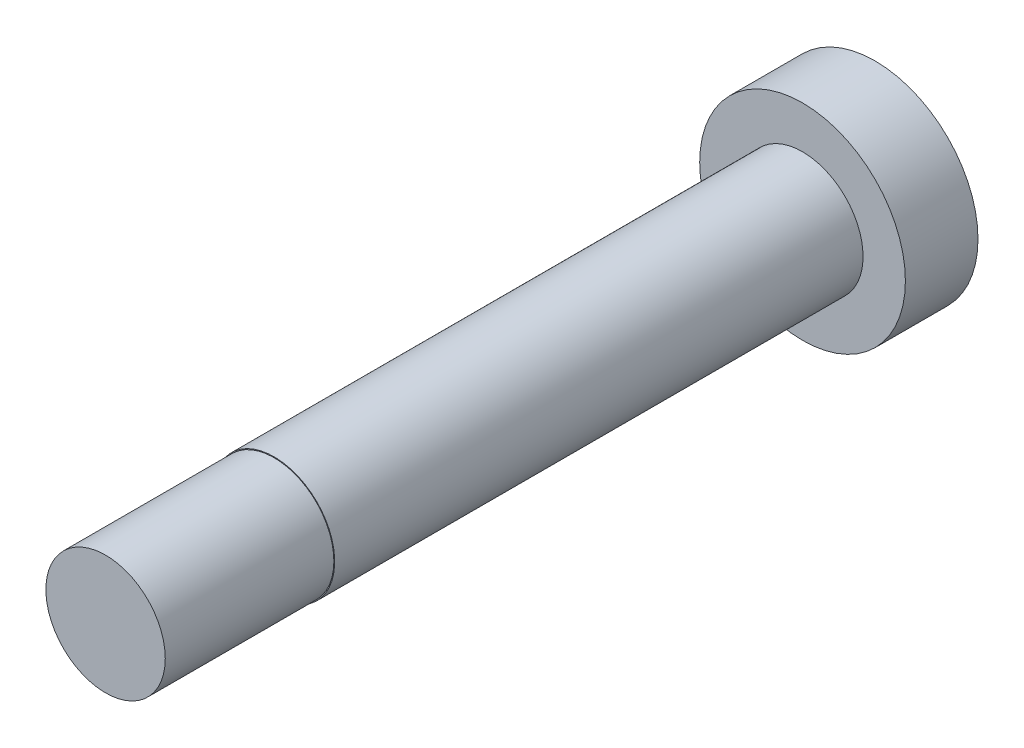
ISO-10303-21;
HEADER;
FILE_DESCRIPTION(('STEP AP214'),'2;1');
FILE_NAME('part.step','',(''),(''),'','','');
FILE_SCHEMA(('AUTOMOTIVE_DESIGN { 1 0 10303 214 1 1 1 1 }'));
ENDSEC;
DATA;
#1=APPLICATION_CONTEXT('core data for automotive mechanical design processes');
#2=APPLICATION_PROTOCOL_DEFINITION('international standard','automotive_design',2000,#1);
#3=PRODUCT_CONTEXT('',#1,'mechanical');
#4=PRODUCT('Part','Part','',(#3));
#5=PRODUCT_RELATED_PRODUCT_CATEGORY('part','',(#4));
#6=PRODUCT_DEFINITION_FORMATION('','',#4);
#7=PRODUCT_DEFINITION_CONTEXT('part definition',#1,'design');
#8=PRODUCT_DEFINITION('design','',#6,#7);
#9=PRODUCT_DEFINITION_SHAPE('','',#8);
#10=(LENGTH_UNIT() NAMED_UNIT(*) SI_UNIT(.MILLI.,.METRE.));
#11=(NAMED_UNIT(*) PLANE_ANGLE_UNIT() SI_UNIT($,.RADIAN.));
#12=(NAMED_UNIT(*) SI_UNIT($,.STERADIAN.) SOLID_ANGLE_UNIT());
#13=UNCERTAINTY_MEASURE_WITH_UNIT(LENGTH_MEASURE(1.E-05),#10,'distance_accuracy_value','');
#14=(GEOMETRIC_REPRESENTATION_CONTEXT(3) GLOBAL_UNCERTAINTY_ASSIGNED_CONTEXT((#13)) GLOBAL_UNIT_ASSIGNED_CONTEXT((#10,
#11,#12)) REPRESENTATION_CONTEXT('',''));
#15=CARTESIAN_POINT('',(0.,0.,0.));
#16=DIRECTION('',(0.,0.,1.));
#17=DIRECTION('',(1.,0.,0.));
#18=AXIS2_PLACEMENT_3D('',#15,#16,#17);
#19=CARTESIAN_POINT('',(0.,0.,-1.8));
#20=DIRECTION('',(0.,0.,1.));
#21=DIRECTION('',(1.,0.,0.));
#22=AXIS2_PLACEMENT_3D('',#19,#20,#21);
#23=PLANE('',#22);
#24=CARTESIAN_POINT('',(0.,0.,-1.8));
#25=DIRECTION('',(0.,0.,1.));
#26=DIRECTION('',(1.,0.,0.));
#27=AXIS2_PLACEMENT_3D('',#24,#25,#26);
#28=CIRCLE('',#27,2.55);
#29=CARTESIAN_POINT('',(2.55,0.,-1.8));
#30=VERTEX_POINT('',#29);
#31=EDGE_CURVE('E122',#30,#30,#28,.T.);
#32=ORIENTED_EDGE('',*,*,#31,.F.);
#33=EDGE_LOOP('',(#32));
#34=FACE_BOUND('',#33,.T.);
#35=DIRECTION('',(0.,-1.,0.));
#36=VECTOR('',#35,1.);
#37=CARTESIAN_POINT('',(0.995929214352104,0.,-1.8));
#38=LINE('',#37,#36);
#39=CARTESIAN_POINT('',(0.995929214352104,0.575,-1.8));
#40=VERTEX_POINT('',#39);
#41=CARTESIAN_POINT('',(0.995929214352104,-0.575000000000001,-1.8));
#42=VERTEX_POINT('',#41);
#43=EDGE_CURVE('E11',#40,#42,#38,.T.);
#44=ORIENTED_EDGE('',*,*,#43,.F.);
#45=DIRECTION('',(0.866025403784439,-0.5,0.));
#46=VECTOR('',#45,1.);
#47=CARTESIAN_POINT('',(0.497964607176052,0.8625,-1.8));
#48=LINE('',#47,#46);
#49=CARTESIAN_POINT('',(0.,1.15,-1.8));
#50=VERTEX_POINT('',#49);
#51=EDGE_CURVE('E50',#50,#40,#48,.T.);
#52=ORIENTED_EDGE('',*,*,#51,.F.);
#53=DIRECTION('',(0.866025403784439,0.5,0.));
#54=VECTOR('',#53,1.);
#55=CARTESIAN_POINT('',(-0.497964607176052,0.8625,-1.8));
#56=LINE('',#55,#54);
#57=CARTESIAN_POINT('',(-0.995929214352104,0.575,-1.8));
#58=VERTEX_POINT('',#57);
#59=EDGE_CURVE('E140',#58,#50,#56,.T.);
#60=ORIENTED_EDGE('',*,*,#59,.F.);
#61=DIRECTION('',(0.,1.,0.));
#62=VECTOR('',#61,1.);
#63=CARTESIAN_POINT('',(-0.995929214352104,0.,-1.8));
#64=LINE('',#63,#62);
#65=CARTESIAN_POINT('',(-0.995929214352104,-0.575,-1.8));
#66=VERTEX_POINT('',#65);
#67=EDGE_CURVE('E135',#66,#58,#64,.T.);
#68=ORIENTED_EDGE('',*,*,#67,.F.);
#69=DIRECTION('',(-0.866025403784439,0.5,0.));
#70=VECTOR('',#69,1.);
#71=CARTESIAN_POINT('',(-0.497964607176052,-0.8625,-1.8));
#72=LINE('',#71,#70);
#73=CARTESIAN_POINT('',(0.,-1.15,-1.8));
#74=VERTEX_POINT('',#73);
#75=EDGE_CURVE('E134',#74,#66,#72,.T.);
#76=ORIENTED_EDGE('',*,*,#75,.F.);
#77=DIRECTION('',(-0.866025403784439,-0.5,0.));
#78=VECTOR('',#77,1.);
#79=CARTESIAN_POINT('',(0.497964607176052,-0.8625,-1.8));
#80=LINE('',#79,#78);
#81=EDGE_CURVE('E120',#42,#74,#80,.T.);
#82=ORIENTED_EDGE('',*,*,#81,.F.);
#83=EDGE_LOOP('',(#44,#52,#60,#68,#76,#82));
#84=FACE_BOUND('',#83,.T.);
#85=ADVANCED_FACE('F39',(#34,#84),#23,.F.);
#86=CARTESIAN_POINT('',(0.,0.,0.));
#87=DIRECTION('',(0.,0.,-1.));
#88=DIRECTION('',(-1.,0.,0.));
#89=AXIS2_PLACEMENT_3D('',#86,#87,#88);
#90=CYLINDRICAL_SURFACE('',#89,2.55);
#91=CARTESIAN_POINT('',(0.,0.,0.));
#92=DIRECTION('',(0.,0.,1.));
#93=DIRECTION('',(1.,0.,0.));
#94=AXIS2_PLACEMENT_3D('',#91,#92,#93);
#95=CIRCLE('',#94,2.55);
#96=CARTESIAN_POINT('',(2.55,0.,0.));
#97=VERTEX_POINT('',#96);
#98=EDGE_CURVE('E130',#97,#97,#95,.T.);
#99=ORIENTED_EDGE('',*,*,#98,.F.);
#100=EDGE_LOOP('',(#99));
#101=FACE_BOUND('',#100,.T.);
#102=ORIENTED_EDGE('',*,*,#31,.T.);
#103=EDGE_LOOP('',(#102));
#104=FACE_BOUND('',#103,.T.);
#105=ADVANCED_FACE('F41',(#101,#104),#90,.T.);
#106=CARTESIAN_POINT('',(0.,0.,0.));
#107=DIRECTION('',(0.,0.,1.));
#108=DIRECTION('',(1.,0.,0.));
#109=AXIS2_PLACEMENT_3D('',#106,#107,#108);
#110=PLANE('',#109);
#111=CARTESIAN_POINT('',(0.,0.,0.));
#112=DIRECTION('',(0.,0.,1.));
#113=DIRECTION('',(1.,0.,0.));
#114=AXIS2_PLACEMENT_3D('',#111,#112,#113);
#115=CIRCLE('',#114,1.5);
#116=CARTESIAN_POINT('',(-1.5,0.,0.));
#117=VERTEX_POINT('',#116);
#118=EDGE_CURVE('E123',#117,#117,#115,.T.);
#119=ORIENTED_EDGE('',*,*,#118,.F.);
#120=EDGE_LOOP('',(#119));
#121=FACE_BOUND('',#120,.T.);
#122=ORIENTED_EDGE('',*,*,#98,.T.);
#123=EDGE_LOOP('',(#122));
#124=FACE_BOUND('',#123,.T.);
#125=ADVANCED_FACE('F184',(#121,#124),#110,.T.);
#126=CARTESIAN_POINT('',(0.,0.,13.1));
#127=DIRECTION('',(0.,0.,-1.));
#128=DIRECTION('',(-1.,0.,0.));
#129=AXIS2_PLACEMENT_3D('',#126,#127,#128);
#130=CYLINDRICAL_SURFACE('',#129,1.5);
#131=CARTESIAN_POINT('',(0.,0.,13.1));
#132=DIRECTION('',(0.,0.,1.));
#133=DIRECTION('',(1.,0.,0.));
#134=AXIS2_PLACEMENT_3D('',#131,#132,#133);
#135=CIRCLE('',#134,1.5);
#136=CARTESIAN_POINT('',(-1.5,0.,13.1));
#137=VERTEX_POINT('',#136);
#138=EDGE_CURVE('E112',#137,#137,#135,.T.);
#139=CARTESIAN_POINT('',(-1.5,0.,13.1));
#140=CARTESIAN_POINT('',(-1.5,0.,12.9635416666667));
#141=CARTESIAN_POINT('',(-1.5,0.,12.8270833333333));
#142=CARTESIAN_POINT('',(-1.5,0.,12.5541666666667));
#143=CARTESIAN_POINT('',(-1.5,0.,12.4177083333333));
#144=CARTESIAN_POINT('',(-1.5,0.,12.1447916666667));
#145=CARTESIAN_POINT('',(-1.5,0.,12.0083333333333));
#146=CARTESIAN_POINT('',(-1.5,0.,11.7354166666667));
#147=CARTESIAN_POINT('',(-1.5,0.,11.5989583333333));
#148=CARTESIAN_POINT('',(-1.5,0.,11.3260416666667));
#149=CARTESIAN_POINT('',(-1.5,0.,11.1895833333333));
#150=CARTESIAN_POINT('',(-1.5,0.,10.9166666666667));
#151=CARTESIAN_POINT('',(-1.5,0.,10.7802083333333));
#152=CARTESIAN_POINT('',(-1.5,0.,10.5072916666667));
#153=CARTESIAN_POINT('',(-1.5,0.,10.3708333333333));
#154=CARTESIAN_POINT('',(-1.5,0.,10.0979166666667));
#155=CARTESIAN_POINT('',(-1.5,0.,9.96145833333333));
#156=CARTESIAN_POINT('',(-1.5,0.,9.68854166666667));
#157=CARTESIAN_POINT('',(-1.5,0.,9.55208333333333));
#158=CARTESIAN_POINT('',(-1.5,0.,9.27916666666667));
#159=CARTESIAN_POINT('',(-1.5,0.,9.14270833333333));
#160=CARTESIAN_POINT('',(-1.5,0.,8.86979166666667));
#161=CARTESIAN_POINT('',(-1.5,0.,8.73333333333333));
#162=CARTESIAN_POINT('',(-1.5,0.,8.46041666666667));
#163=CARTESIAN_POINT('',(-1.5,0.,8.32395833333333));
#164=CARTESIAN_POINT('',(-1.5,0.,8.05104166666667));
#165=CARTESIAN_POINT('',(-1.5,0.,7.91458333333333));
#166=CARTESIAN_POINT('',(-1.5,0.,7.64166666666667));
#167=CARTESIAN_POINT('',(-1.5,0.,7.50520833333333));
#168=CARTESIAN_POINT('',(-1.5,0.,7.23229166666667));
#169=CARTESIAN_POINT('',(-1.5,0.,7.09583333333333));
#170=CARTESIAN_POINT('',(-1.5,0.,6.82291666666667));
#171=CARTESIAN_POINT('',(-1.5,0.,6.68645833333333));
#172=CARTESIAN_POINT('',(-1.5,0.,6.41354166666667));
#173=CARTESIAN_POINT('',(-1.5,0.,6.27708333333333));
#174=CARTESIAN_POINT('',(-1.5,0.,6.00416666666667));
#175=CARTESIAN_POINT('',(-1.5,0.,5.86770833333333));
#176=CARTESIAN_POINT('',(-1.5,0.,5.59479166666667));
#177=CARTESIAN_POINT('',(-1.5,0.,5.45833333333333));
#178=CARTESIAN_POINT('',(-1.5,0.,5.18541666666667));
#179=CARTESIAN_POINT('',(-1.5,0.,5.04895833333333));
#180=CARTESIAN_POINT('',(-1.5,0.,4.77604166666667));
#181=CARTESIAN_POINT('',(-1.5,0.,4.63958333333333));
#182=CARTESIAN_POINT('',(-1.5,0.,4.36666666666667));
#183=CARTESIAN_POINT('',(-1.5,0.,4.23020833333333));
#184=CARTESIAN_POINT('',(-1.5,0.,3.95729166666667));
#185=CARTESIAN_POINT('',(-1.5,0.,3.82083333333333));
#186=CARTESIAN_POINT('',(-1.5,0.,3.54791666666666));
#187=CARTESIAN_POINT('',(-1.5,0.,3.41145833333333));
#188=CARTESIAN_POINT('',(-1.5,0.,3.13854166666667));
#189=CARTESIAN_POINT('',(-1.5,0.,3.00208333333333));
#190=CARTESIAN_POINT('',(-1.5,0.,2.72916666666666));
#191=CARTESIAN_POINT('',(-1.5,0.,2.59270833333333));
#192=CARTESIAN_POINT('',(-1.5,0.,2.31979166666666));
#193=CARTESIAN_POINT('',(-1.5,0.,2.18333333333333));
#194=CARTESIAN_POINT('',(-1.5,0.,1.91041666666667));
#195=CARTESIAN_POINT('',(-1.5,0.,1.77395833333333));
#196=CARTESIAN_POINT('',(-1.5,0.,1.50104166666667));
#197=CARTESIAN_POINT('',(-1.5,0.,1.36458333333333));
#198=CARTESIAN_POINT('',(-1.5,0.,1.09166666666667));
#199=CARTESIAN_POINT('',(-1.5,0.,0.955208333333332));
#200=CARTESIAN_POINT('',(-1.5,0.,0.682291666666665));
#201=CARTESIAN_POINT('',(-1.5,0.,0.545833333333332));
#202=CARTESIAN_POINT('',(-1.5,0.,0.272916666666665));
#203=CARTESIAN_POINT('',(-1.5,0.,0.136458333333332));
#204=CARTESIAN_POINT('',(-1.5,0.,0.));
#205=B_SPLINE_CURVE_WITH_KNOTS('',3,(#139,#140,#141,#142,#143,#144,#145,#146,#147,#148,#149,
#150,#151,#152,#153,#154,#155,#156,#157,#158,#159,#160,#161,#162,#163,#164,#165,#166,#167,#168,
#169,#170,#171,#172,#173,#174,#175,#176,#177,#178,#179,#180,#181,#182,#183,#184,#185,#186,#187,
#188,#189,#190,#191,#192,#193,#194,#195,#196,#197,#198,#199,#200,#201,#202,#203,#204),
.UNSPECIFIED.,.F.,.F.,(4,2,2,2,2,2,2,2,2,2,2,2,2,2,2,2,2,2,2,2,2,2,2,2,2,2,2,2,2,2,2,2,4),(0.,
0.409374999999998,0.818749999999998,1.228125,1.6375,2.046875,2.45625,2.865625,3.275,3.684375,
4.09375,4.503125,4.9125,5.321875,5.73125,6.140625,6.55,6.959375,7.36875,7.778125,8.1875,
8.596875,9.00625,9.415625,9.825,10.234375,10.64375,11.053125,11.4625,11.871875,12.28125,
12.690625,13.1),.UNSPECIFIED.);
#206=EDGE_CURVE('BSEAM190',#137,#117,#205,.T.);
#207=ORIENTED_EDGE('',*,*,#138,.F.);
#208=ORIENTED_EDGE('',*,*,#118,.T.);
#209=ORIENTED_EDGE('',*,*,#206,.T.);
#210=ORIENTED_EDGE('',*,*,#206,.F.);
#211=EDGE_LOOP('',(#207,#209,#208,#210));
#212=FACE_BOUND('',#211,.T.);
#213=ADVANCED_FACE('F190',(#212),#130,.T.);
#214=CARTESIAN_POINT('',(0.,0.,13.1));
#215=DIRECTION('',(0.,0.,1.));
#216=DIRECTION('',(1.,0.,0.));
#217=AXIS2_PLACEMENT_3D('',#214,#215,#216);
#218=PLANE('',#217);
#219=CARTESIAN_POINT('',(0.,0.,13.1));
#220=DIRECTION('',(0.,0.,1.));
#221=DIRECTION('',(1.,0.,0.));
#222=AXIS2_PLACEMENT_3D('',#219,#220,#221);
#223=CIRCLE('',#222,1.48);
#224=CARTESIAN_POINT('',(1.48,0.,13.1));
#225=VERTEX_POINT('',#224);
#226=EDGE_CURVE('E117',#225,#225,#223,.T.);
#227=ORIENTED_EDGE('',*,*,#226,.F.);
#228=EDGE_LOOP('',(#227));
#229=FACE_BOUND('',#228,.T.);
#230=ORIENTED_EDGE('',*,*,#138,.T.);
#231=EDGE_LOOP('',(#230));
#232=FACE_BOUND('',#231,.T.);
#233=ADVANCED_FACE('F192',(#229,#232),#218,.T.);
#234=CARTESIAN_POINT('',(0.,0.,17.28));
#235=DIRECTION('',(0.,0.,-1.));
#236=DIRECTION('',(-1.,0.,0.));
#237=AXIS2_PLACEMENT_3D('',#234,#235,#236);
#238=CYLINDRICAL_SURFACE('',#237,1.48);
#239=CARTESIAN_POINT('',(0.,0.,17.28));
#240=DIRECTION('',(0.,0.,1.));
#241=DIRECTION('',(1.,0.,0.));
#242=AXIS2_PLACEMENT_3D('',#239,#240,#241);
#243=CIRCLE('',#242,1.48);
#244=CARTESIAN_POINT('',(1.48,0.,17.28));
#245=VERTEX_POINT('',#244);
#246=EDGE_CURVE('E110',#245,#245,#243,.T.);
#247=ORIENTED_EDGE('',*,*,#246,.F.);
#248=EDGE_LOOP('',(#247));
#249=FACE_BOUND('',#248,.T.);
#250=ORIENTED_EDGE('',*,*,#226,.T.);
#251=EDGE_LOOP('',(#250));
#252=FACE_BOUND('',#251,.T.);
#253=ADVANCED_FACE('F196',(#249,#252),#238,.T.);
#254=CARTESIAN_POINT('',(0.,0.,17.28));
#255=DIRECTION('',(0.,0.,1.));
#256=DIRECTION('',(1.,0.,0.));
#257=AXIS2_PLACEMENT_3D('',#254,#255,#256);
#258=PLANE('',#257);
#259=ORIENTED_EDGE('',*,*,#246,.T.);
#260=EDGE_LOOP('',(#259));
#261=FACE_BOUND('',#260,.T.);
#262=ADVANCED_FACE('F205',(#261),#258,.T.);
#263=CARTESIAN_POINT('',(0.995929214352104,-0.575000000000001,-0.85));
#264=DIRECTION('',(-1.,0.,0.));
#265=DIRECTION('',(0.,-1.,0.));
#266=AXIS2_PLACEMENT_3D('',#263,#264,#265);
#267=PLANE('',#266);
#268=ORIENTED_EDGE('',*,*,#43,.T.);
#269=DIRECTION('',(0.,0.,-1.));
#270=VECTOR('',#269,1.);
#271=CARTESIAN_POINT('',(0.995929214352104,-0.575000000000001,-0.85));
#272=LINE('',#271,#270);
#273=CARTESIAN_POINT('',(0.995929214352104,-0.575000000000001,-0.85));
#274=VERTEX_POINT('',#273);
#275=EDGE_CURVE('E53',#274,#42,#272,.T.);
#276=ORIENTED_EDGE('',*,*,#275,.F.);
#277=DIRECTION('',(0.,1.,0.));
#278=VECTOR('',#277,1.);
#279=CARTESIAN_POINT('',(0.995929214352104,-0.575000000000001,-0.85));
#280=LINE('',#279,#278);
#281=CARTESIAN_POINT('',(0.995929214352104,0.575,-0.85));
#282=VERTEX_POINT('',#281);
#283=EDGE_CURVE('E96',#274,#282,#280,.T.);
#284=ORIENTED_EDGE('',*,*,#283,.T.);
#285=DIRECTION('',(0.,0.,-1.));
#286=VECTOR('',#285,1.);
#287=CARTESIAN_POINT('',(0.995929214352104,0.575,-0.85));
#288=LINE('',#287,#286);
#289=EDGE_CURVE('E103',#282,#40,#288,.T.);
#290=ORIENTED_EDGE('',*,*,#289,.T.);
#291=EDGE_LOOP('',(#268,#276,#284,#290));
#292=FACE_BOUND('',#291,.T.);
#293=ADVANCED_FACE('F105',(#292),#267,.T.);
#294=CARTESIAN_POINT('',(0.995929214352104,0.575,-0.85));
#295=DIRECTION('',(-0.5,-0.866025403784439,0.));
#296=DIRECTION('',(0.866025403784439,-0.5,0.));
#297=AXIS2_PLACEMENT_3D('',#294,#295,#296);
#298=PLANE('',#297);
#299=ORIENTED_EDGE('',*,*,#51,.T.);
#300=ORIENTED_EDGE('',*,*,#289,.F.);
#301=DIRECTION('',(-0.866025403784439,0.5,0.));
#302=VECTOR('',#301,1.);
#303=CARTESIAN_POINT('',(0.995929214352104,0.575,-0.85));
#304=LINE('',#303,#302);
#305=CARTESIAN_POINT('',(0.,1.15,-0.85));
#306=VERTEX_POINT('',#305);
#307=EDGE_CURVE('E95',#282,#306,#304,.T.);
#308=ORIENTED_EDGE('',*,*,#307,.T.);
#309=DIRECTION('',(0.,0.,-1.));
#310=VECTOR('',#309,1.);
#311=CARTESIAN_POINT('',(0.,1.15,-0.85));
#312=LINE('',#311,#310);
#313=EDGE_CURVE('E107',#306,#50,#312,.T.);
#314=ORIENTED_EDGE('',*,*,#313,.T.);
#315=EDGE_LOOP('',(#299,#300,#308,#314));
#316=FACE_BOUND('',#315,.T.);
#317=ADVANCED_FACE('F106',(#316),#298,.T.);
#318=CARTESIAN_POINT('',(0.,1.15,-0.85));
#319=DIRECTION('',(0.5,-0.866025403784439,0.));
#320=DIRECTION('',(0.866025403784439,0.5,0.));
#321=AXIS2_PLACEMENT_3D('',#318,#319,#320);
#322=PLANE('',#321);
#323=ORIENTED_EDGE('',*,*,#59,.T.);
#324=ORIENTED_EDGE('',*,*,#313,.F.);
#325=DIRECTION('',(-0.866025403784439,-0.5,0.));
#326=VECTOR('',#325,1.);
#327=CARTESIAN_POINT('',(0.,1.15,-0.85));
#328=LINE('',#327,#326);
#329=CARTESIAN_POINT('',(-0.995929214352104,0.575,-0.85));
#330=VERTEX_POINT('',#329);
#331=EDGE_CURVE('E98',#306,#330,#328,.T.);
#332=ORIENTED_EDGE('',*,*,#331,.T.);
#333=DIRECTION('',(0.,0.,-1.));
#334=VECTOR('',#333,1.);
#335=CARTESIAN_POINT('',(-0.995929214352104,0.575,-0.85));
#336=LINE('',#335,#334);
#337=EDGE_CURVE('E114',#330,#58,#336,.T.);
#338=ORIENTED_EDGE('',*,*,#337,.T.);
#339=EDGE_LOOP('',(#323,#324,#332,#338));
#340=FACE_BOUND('',#339,.T.);
#341=ADVANCED_FACE('F143',(#340),#322,.T.);
#342=CARTESIAN_POINT('',(-0.995929214352104,0.575,-0.85));
#343=DIRECTION('',(1.,0.,0.));
#344=DIRECTION('',(0.,0.,-1.));
#345=AXIS2_PLACEMENT_3D('',#342,#343,#344);
#346=PLANE('',#345);
#347=ORIENTED_EDGE('',*,*,#67,.T.);
#348=ORIENTED_EDGE('',*,*,#337,.F.);
#349=DIRECTION('',(0.,-1.,0.));
#350=VECTOR('',#349,1.);
#351=CARTESIAN_POINT('',(-0.995929214352104,0.575,-0.85));
#352=LINE('',#351,#350);
#353=CARTESIAN_POINT('',(-0.995929214352104,-0.575,-0.85));
#354=VERTEX_POINT('',#353);
#355=EDGE_CURVE('E164',#330,#354,#352,.T.);
#356=ORIENTED_EDGE('',*,*,#355,.T.);
#357=DIRECTION('',(0.,0.,-1.));
#358=VECTOR('',#357,1.);
#359=CARTESIAN_POINT('',(-0.995929214352104,-0.575,-0.85));
#360=LINE('',#359,#358);
#361=EDGE_CURVE('E160',#354,#66,#360,.T.);
#362=ORIENTED_EDGE('',*,*,#361,.T.);
#363=EDGE_LOOP('',(#347,#348,#356,#362));
#364=FACE_BOUND('',#363,.T.);
#365=ADVANCED_FACE('F169',(#364),#346,.T.);
#366=CARTESIAN_POINT('',(-0.995929214352104,-0.575,-0.85));
#367=DIRECTION('',(0.5,0.866025403784439,0.));
#368=DIRECTION('',(-0.866025403784439,0.5,0.));
#369=AXIS2_PLACEMENT_3D('',#366,#367,#368);
#370=PLANE('',#369);
#371=ORIENTED_EDGE('',*,*,#75,.T.);
#372=ORIENTED_EDGE('',*,*,#361,.F.);
#373=DIRECTION('',(0.866025403784439,-0.5,0.));
#374=VECTOR('',#373,1.);
#375=CARTESIAN_POINT('',(-0.995929214352104,-0.575,-0.85));
#376=LINE('',#375,#374);
#377=CARTESIAN_POINT('',(0.,-1.15,-0.85));
#378=VERTEX_POINT('',#377);
#379=EDGE_CURVE('E156',#354,#378,#376,.T.);
#380=ORIENTED_EDGE('',*,*,#379,.T.);
#381=DIRECTION('',(0.,0.,-1.));
#382=VECTOR('',#381,1.);
#383=CARTESIAN_POINT('',(0.,-1.15,-0.85));
#384=LINE('',#383,#382);
#385=EDGE_CURVE('E147',#378,#74,#384,.T.);
#386=ORIENTED_EDGE('',*,*,#385,.T.);
#387=EDGE_LOOP('',(#371,#372,#380,#386));
#388=FACE_BOUND('',#387,.T.);
#389=ADVANCED_FACE('F155',(#388),#370,.T.);
#390=CARTESIAN_POINT('',(0.,-1.15,-0.85));
#391=DIRECTION('',(-0.5,0.866025403784439,0.));
#392=DIRECTION('',(-0.866025403784439,-0.5,0.));
#393=AXIS2_PLACEMENT_3D('',#390,#391,#392);
#394=PLANE('',#393);
#395=ORIENTED_EDGE('',*,*,#81,.T.);
#396=ORIENTED_EDGE('',*,*,#385,.F.);
#397=DIRECTION('',(0.866025403784439,0.5,0.));
#398=VECTOR('',#397,1.);
#399=CARTESIAN_POINT('',(0.,-1.15,-0.85));
#400=LINE('',#399,#398);
#401=EDGE_CURVE('E159',#378,#274,#400,.T.);
#402=ORIENTED_EDGE('',*,*,#401,.T.);
#403=ORIENTED_EDGE('',*,*,#275,.T.);
#404=EDGE_LOOP('',(#395,#396,#402,#403));
#405=FACE_BOUND('',#404,.T.);
#406=ADVANCED_FACE('F149',(#405),#394,.T.);
#407=CARTESIAN_POINT('',(0.,0.,-0.85));
#408=DIRECTION('',(0.,0.,1.));
#409=DIRECTION('',(1.,0.,0.));
#410=AXIS2_PLACEMENT_3D('',#407,#408,#409);
#411=PLANE('',#410);
#412=ORIENTED_EDGE('',*,*,#283,.F.);
#413=ORIENTED_EDGE('',*,*,#401,.F.);
#414=ORIENTED_EDGE('',*,*,#379,.F.);
#415=ORIENTED_EDGE('',*,*,#355,.F.);
#416=ORIENTED_EDGE('',*,*,#331,.F.);
#417=ORIENTED_EDGE('',*,*,#307,.F.);
#418=EDGE_LOOP('',(#412,#413,#414,#415,#416,#417));
#419=FACE_BOUND('',#418,.T.);
#420=ADVANCED_FACE('F94',(#419),#411,.F.);
#421=CLOSED_SHELL('',(#85,#105,#125,#213,#233,#253,#262,#293,#317,#341,#365,#389,#406,#420));
#422=MANIFOLD_SOLID_BREP('B2',#421);
#423=ADVANCED_BREP_SHAPE_REPRESENTATION('',(#18,#422),#14);
#424=SHAPE_DEFINITION_REPRESENTATION(#9,#423);
ENDSEC;
END-ISO-10303-21;
